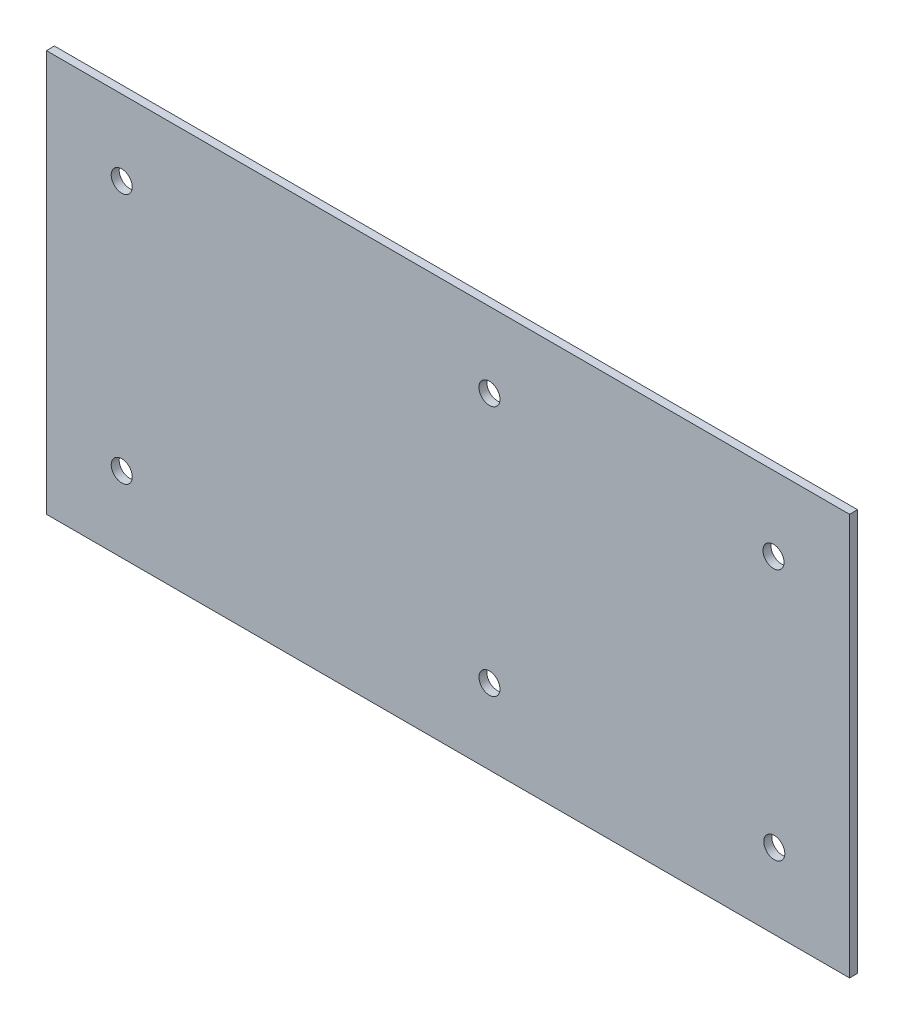
ISO-10303-21;
HEADER;
FILE_DESCRIPTION(('STEP AP214'),'2;1');
FILE_NAME('part.step','',(''),(''),'','','');
FILE_SCHEMA(('AUTOMOTIVE_DESIGN { 1 0 10303 214 1 1 1 1 }'));
ENDSEC;
DATA;
#1=APPLICATION_CONTEXT('core data for automotive mechanical design processes');
#2=APPLICATION_PROTOCOL_DEFINITION('international standard','automotive_design',2000,#1);
#3=PRODUCT_CONTEXT('',#1,'mechanical');
#4=PRODUCT('Part','Part','',(#3));
#5=PRODUCT_RELATED_PRODUCT_CATEGORY('part','',(#4));
#6=PRODUCT_DEFINITION_FORMATION('','',#4);
#7=PRODUCT_DEFINITION_CONTEXT('part definition',#1,'design');
#8=PRODUCT_DEFINITION('design','',#6,#7);
#9=PRODUCT_DEFINITION_SHAPE('','',#8);
#10=(LENGTH_UNIT() NAMED_UNIT(*) SI_UNIT(.MILLI.,.METRE.));
#11=(NAMED_UNIT(*) PLANE_ANGLE_UNIT() SI_UNIT($,.RADIAN.));
#12=(NAMED_UNIT(*) SI_UNIT($,.STERADIAN.) SOLID_ANGLE_UNIT());
#13=UNCERTAINTY_MEASURE_WITH_UNIT(LENGTH_MEASURE(1.E-05),#10,'distance_accuracy_value','');
#14=(GEOMETRIC_REPRESENTATION_CONTEXT(3) GLOBAL_UNCERTAINTY_ASSIGNED_CONTEXT((#13)) GLOBAL_UNIT_ASSIGNED_CONTEXT((#10,
#11,#12)) REPRESENTATION_CONTEXT('',''));
#15=CARTESIAN_POINT('',(0.,0.,0.));
#16=DIRECTION('',(0.,0.,1.));
#17=DIRECTION('',(1.,0.,0.));
#18=AXIS2_PLACEMENT_3D('',#15,#16,#17);
#19=CARTESIAN_POINT('',(0.,0.,1.5875));
#20=DIRECTION('',(0.,0.,1.));
#21=DIRECTION('',(1.,0.,0.));
#22=AXIS2_PLACEMENT_3D('',#19,#20,#21);
#23=PLANE('',#22);
#24=CARTESIAN_POINT('',(40.5172410112099,-26.9254115006689,1.5875));
#25=DIRECTION('',(0.,0.,1.));
#26=DIRECTION('',(1.,0.,0.));
#27=AXIS2_PLACEMENT_3D('',#24,#25,#26);
#28=CIRCLE('',#27,2.0955);
#29=CARTESIAN_POINT('',(42.6127410112099,-26.9254115006689,1.5875));
#30=VERTEX_POINT('',#29);
#31=EDGE_CURVE('E158',#30,#30,#28,.T.);
#32=ORIENTED_EDGE('',*,*,#31,.F.);
#33=EDGE_LOOP('',(#32));
#34=FACE_BOUND('',#33,.T.);
#35=CARTESIAN_POINT('',(40.5172410112098,23.0745884993311,1.5875));
#36=DIRECTION('',(0.,0.,1.));
#37=DIRECTION('',(1.,0.,0.));
#38=AXIS2_PLACEMENT_3D('',#35,#36,#37);
#39=CIRCLE('',#38,2.0955);
#40=CARTESIAN_POINT('',(42.6127410112098,23.0745884993311,1.5875));
#41=VERTEX_POINT('',#40);
#42=EDGE_CURVE('E142',#41,#41,#39,.T.);
#43=ORIENTED_EDGE('',*,*,#42,.F.);
#44=EDGE_LOOP('',(#43));
#45=FACE_BOUND('',#44,.T.);
#46=CARTESIAN_POINT('',(-32.7327589887902,23.0745884993311,1.5875));
#47=DIRECTION('',(0.,0.,1.));
#48=DIRECTION('',(1.,0.,0.));
#49=AXIS2_PLACEMENT_3D('',#46,#47,#48);
#50=CIRCLE('',#49,2.0955);
#51=CARTESIAN_POINT('',(-30.6372589887902,23.0745884993311,1.5875));
#52=VERTEX_POINT('',#51);
#53=EDGE_CURVE('E112',#52,#52,#50,.T.);
#54=ORIENTED_EDGE('',*,*,#53,.F.);
#55=EDGE_LOOP('',(#54));
#56=FACE_BOUND('',#55,.T.);
#57=DIRECTION('',(0.,-1.,0.));
#58=VECTOR('',#57,1.);
#59=CARTESIAN_POINT('',(-47.7339989887902,38.0758284993311,1.5875));
#60=LINE('',#59,#58);
#61=CARTESIAN_POINT('',(-47.7339989887902,38.0758284993311,1.5875));
#62=VERTEX_POINT('',#61);
#63=CARTESIAN_POINT('',(-47.7339989887902,-41.9266515006689,1.5875));
#64=VERTEX_POINT('',#63);
#65=EDGE_CURVE('E92',#62,#64,#60,.T.);
#66=ORIENTED_EDGE('',*,*,#65,.T.);
#67=DIRECTION('',(1.,0.,0.));
#68=VECTOR('',#67,1.);
#69=CARTESIAN_POINT('',(-47.7339989887902,-41.9266515006689,1.5875));
#70=LINE('',#69,#68);
#71=CARTESIAN_POINT('',(112.26848101121,-41.9266515006689,1.5875));
#72=VERTEX_POINT('',#71);
#73=EDGE_CURVE('E87',#64,#72,#70,.T.);
#74=ORIENTED_EDGE('',*,*,#73,.T.);
#75=DIRECTION('',(0.,1.,0.));
#76=VECTOR('',#75,1.);
#77=CARTESIAN_POINT('',(112.26848101121,38.0758284993311,1.5875));
#78=LINE('',#77,#76);
#79=CARTESIAN_POINT('',(112.26848101121,38.0758284993311,1.5875));
#80=VERTEX_POINT('',#79);
#81=EDGE_CURVE('E90',#72,#80,#78,.T.);
#82=ORIENTED_EDGE('',*,*,#81,.T.);
#83=DIRECTION('',(-1.,0.,0.));
#84=VECTOR('',#83,1.);
#85=CARTESIAN_POINT('',(-47.7339989887902,38.0758284993311,1.5875));
#86=LINE('',#85,#84);
#87=EDGE_CURVE('E57',#80,#62,#86,.T.);
#88=ORIENTED_EDGE('',*,*,#87,.T.);
#89=EDGE_LOOP('',(#66,#74,#82,#88));
#90=FACE_BOUND('',#89,.T.);
#91=CARTESIAN_POINT('',(-32.7327589887902,-26.9254115006689,1.5875));
#92=DIRECTION('',(0.,0.,1.));
#93=DIRECTION('',(1.,0.,0.));
#94=AXIS2_PLACEMENT_3D('',#91,#92,#93);
#95=CIRCLE('',#94,2.0955);
#96=CARTESIAN_POINT('',(-30.6372589887902,-26.9254115006689,1.5875));
#97=VERTEX_POINT('',#96);
#98=EDGE_CURVE('E134',#97,#97,#95,.T.);
#99=ORIENTED_EDGE('',*,*,#98,.F.);
#100=EDGE_LOOP('',(#99));
#101=FACE_BOUND('',#100,.T.);
#102=CARTESIAN_POINT('',(97.1085339887547,23.2332955217862,1.5875));
#103=DIRECTION('',(0.,0.,1.));
#104=DIRECTION('',(1.,0.,0.));
#105=AXIS2_PLACEMENT_3D('',#102,#103,#104);
#106=CIRCLE('',#105,2.0955);
#107=CARTESIAN_POINT('',(99.2040339887547,23.2332955217862,1.5875));
#108=VERTEX_POINT('',#107);
#109=EDGE_CURVE('E150',#108,#108,#106,.T.);
#110=ORIENTED_EDGE('',*,*,#109,.F.);
#111=EDGE_LOOP('',(#110));
#112=FACE_BOUND('',#111,.T.);
#113=CARTESIAN_POINT('',(97.2672410112098,-26.9254115006689,1.5875));
#114=DIRECTION('',(0.,0.,1.));
#115=DIRECTION('',(1.,0.,0.));
#116=AXIS2_PLACEMENT_3D('',#113,#114,#115);
#117=CIRCLE('',#116,2.0955);
#118=CARTESIAN_POINT('',(99.3627410112098,-26.9254115006689,1.5875));
#119=VERTEX_POINT('',#118);
#120=EDGE_CURVE('E166',#119,#119,#117,.T.);
#121=ORIENTED_EDGE('',*,*,#120,.F.);
#122=EDGE_LOOP('',(#121));
#123=FACE_BOUND('',#122,.T.);
#124=ADVANCED_FACE('F39',(#34,#45,#56,#90,#101,#112,#123),#23,.T.);
#125=CARTESIAN_POINT('',(0.,0.,0.));
#126=DIRECTION('',(0.,0.,1.));
#127=DIRECTION('',(1.,0.,0.));
#128=AXIS2_PLACEMENT_3D('',#125,#126,#127);
#129=PLANE('',#128);
#130=DIRECTION('',(0.,-1.,0.));
#131=VECTOR('',#130,1.);
#132=CARTESIAN_POINT('',(-47.7339989887902,38.0758284993311,0.));
#133=LINE('',#132,#131);
#134=CARTESIAN_POINT('',(-47.7339989887902,38.0758284993311,0.));
#135=VERTEX_POINT('',#134);
#136=CARTESIAN_POINT('',(-47.7339989887902,-41.9266515006689,0.));
#137=VERTEX_POINT('',#136);
#138=EDGE_CURVE('E108',#135,#137,#133,.T.);
#139=ORIENTED_EDGE('',*,*,#138,.F.);
#140=DIRECTION('',(-1.,0.,0.));
#141=VECTOR('',#140,1.);
#142=CARTESIAN_POINT('',(-47.7339989887902,38.0758284993311,0.));
#143=LINE('',#142,#141);
#144=CARTESIAN_POINT('',(112.26848101121,38.0758284993311,0.));
#145=VERTEX_POINT('',#144);
#146=EDGE_CURVE('E80',#145,#135,#143,.T.);
#147=ORIENTED_EDGE('',*,*,#146,.F.);
#148=DIRECTION('',(0.,1.,0.));
#149=VECTOR('',#148,1.);
#150=CARTESIAN_POINT('',(112.26848101121,38.0758284993311,0.));
#151=LINE('',#150,#149);
#152=CARTESIAN_POINT('',(112.26848101121,-41.9266515006689,0.));
#153=VERTEX_POINT('',#152);
#154=EDGE_CURVE('E74',#153,#145,#151,.T.);
#155=ORIENTED_EDGE('',*,*,#154,.F.);
#156=DIRECTION('',(1.,0.,0.));
#157=VECTOR('',#156,1.);
#158=CARTESIAN_POINT('',(-47.7339989887902,-41.9266515006689,0.));
#159=LINE('',#158,#157);
#160=EDGE_CURVE('E97',#137,#153,#159,.T.);
#161=ORIENTED_EDGE('',*,*,#160,.F.);
#162=EDGE_LOOP('',(#139,#147,#155,#161));
#163=FACE_BOUND('',#162,.T.);
#164=CARTESIAN_POINT('',(-32.7327589887902,23.0745884993311,0.));
#165=DIRECTION('',(0.,0.,1.));
#166=DIRECTION('',(1.,0.,0.));
#167=AXIS2_PLACEMENT_3D('',#164,#165,#166);
#168=CIRCLE('',#167,2.0955);
#169=CARTESIAN_POINT('',(-30.6372589887902,23.0745884993311,0.));
#170=VERTEX_POINT('',#169);
#171=EDGE_CURVE('E130',#170,#170,#168,.T.);
#172=ORIENTED_EDGE('',*,*,#171,.T.);
#173=EDGE_LOOP('',(#172));
#174=FACE_BOUND('',#173,.T.);
#175=CARTESIAN_POINT('',(-32.7327589887902,-26.9254115006689,0.));
#176=DIRECTION('',(0.,0.,1.));
#177=DIRECTION('',(1.,0.,0.));
#178=AXIS2_PLACEMENT_3D('',#175,#176,#177);
#179=CIRCLE('',#178,2.0955);
#180=CARTESIAN_POINT('',(-30.6372589887902,-26.9254115006689,0.));
#181=VERTEX_POINT('',#180);
#182=EDGE_CURVE('E138',#181,#181,#179,.T.);
#183=ORIENTED_EDGE('',*,*,#182,.T.);
#184=EDGE_LOOP('',(#183));
#185=FACE_BOUND('',#184,.T.);
#186=CARTESIAN_POINT('',(40.5172410112098,23.0745884993311,0.));
#187=DIRECTION('',(0.,0.,1.));
#188=DIRECTION('',(1.,0.,0.));
#189=AXIS2_PLACEMENT_3D('',#186,#187,#188);
#190=CIRCLE('',#189,2.0955);
#191=CARTESIAN_POINT('',(42.6127410112098,23.0745884993311,0.));
#192=VERTEX_POINT('',#191);
#193=EDGE_CURVE('E146',#192,#192,#190,.T.);
#194=ORIENTED_EDGE('',*,*,#193,.T.);
#195=EDGE_LOOP('',(#194));
#196=FACE_BOUND('',#195,.T.);
#197=CARTESIAN_POINT('',(97.1085339887547,23.2332955217862,0.));
#198=DIRECTION('',(0.,0.,1.));
#199=DIRECTION('',(1.,0.,0.));
#200=AXIS2_PLACEMENT_3D('',#197,#198,#199);
#201=CIRCLE('',#200,2.0955);
#202=CARTESIAN_POINT('',(99.2040339887547,23.2332955217862,0.));
#203=VERTEX_POINT('',#202);
#204=EDGE_CURVE('E154',#203,#203,#201,.T.);
#205=ORIENTED_EDGE('',*,*,#204,.T.);
#206=EDGE_LOOP('',(#205));
#207=FACE_BOUND('',#206,.T.);
#208=CARTESIAN_POINT('',(40.5172410112099,-26.9254115006689,0.));
#209=DIRECTION('',(0.,0.,1.));
#210=DIRECTION('',(1.,0.,0.));
#211=AXIS2_PLACEMENT_3D('',#208,#209,#210);
#212=CIRCLE('',#211,2.0955);
#213=CARTESIAN_POINT('',(42.6127410112099,-26.9254115006689,0.));
#214=VERTEX_POINT('',#213);
#215=EDGE_CURVE('E162',#214,#214,#212,.T.);
#216=ORIENTED_EDGE('',*,*,#215,.T.);
#217=EDGE_LOOP('',(#216));
#218=FACE_BOUND('',#217,.T.);
#219=CARTESIAN_POINT('',(97.2672410112098,-26.9254115006689,0.));
#220=DIRECTION('',(0.,0.,1.));
#221=DIRECTION('',(1.,0.,0.));
#222=AXIS2_PLACEMENT_3D('',#219,#220,#221);
#223=CIRCLE('',#222,2.0955);
#224=CARTESIAN_POINT('',(99.3627410112098,-26.9254115006689,0.));
#225=VERTEX_POINT('',#224);
#226=EDGE_CURVE('E170',#225,#225,#223,.T.);
#227=ORIENTED_EDGE('',*,*,#226,.T.);
#228=EDGE_LOOP('',(#227));
#229=FACE_BOUND('',#228,.T.);
#230=ADVANCED_FACE('F125',(#163,#174,#185,#196,#207,#218,#229),#129,.F.);
#231=CARTESIAN_POINT('',(-47.7339989887902,38.0758284993311,1.5875));
#232=DIRECTION('',(1.,0.,0.));
#233=DIRECTION('',(0.,0.,-1.));
#234=AXIS2_PLACEMENT_3D('',#231,#232,#233);
#235=PLANE('',#234);
#236=ORIENTED_EDGE('',*,*,#138,.T.);
#237=DIRECTION('',(0.,0.,-1.));
#238=VECTOR('',#237,1.);
#239=CARTESIAN_POINT('',(-47.7339989887902,-41.9266515006689,1.5875));
#240=LINE('',#239,#238);
#241=EDGE_CURVE('E11',#64,#137,#240,.T.);
#242=ORIENTED_EDGE('',*,*,#241,.F.);
#243=ORIENTED_EDGE('',*,*,#65,.F.);
#244=DIRECTION('',(0.,0.,-1.));
#245=VECTOR('',#244,1.);
#246=CARTESIAN_POINT('',(-47.7339989887902,38.0758284993311,1.5875));
#247=LINE('',#246,#245);
#248=EDGE_CURVE('E104',#62,#135,#247,.T.);
#249=ORIENTED_EDGE('',*,*,#248,.T.);
#250=EDGE_LOOP('',(#236,#242,#243,#249));
#251=FACE_BOUND('',#250,.T.);
#252=ADVANCED_FACE('F41',(#251),#235,.F.);
#253=CARTESIAN_POINT('',(-47.7339989887902,-41.9266515006689,1.5875));
#254=DIRECTION('',(0.,1.,0.));
#255=DIRECTION('',(0.,0.,1.));
#256=AXIS2_PLACEMENT_3D('',#253,#254,#255);
#257=PLANE('',#256);
#258=ORIENTED_EDGE('',*,*,#160,.T.);
#259=DIRECTION('',(0.,0.,-1.));
#260=VECTOR('',#259,1.);
#261=CARTESIAN_POINT('',(112.26848101121,-41.9266515006689,1.5875));
#262=LINE('',#261,#260);
#263=EDGE_CURVE('E49',#72,#153,#262,.T.);
#264=ORIENTED_EDGE('',*,*,#263,.F.);
#265=ORIENTED_EDGE('',*,*,#73,.F.);
#266=ORIENTED_EDGE('',*,*,#241,.T.);
#267=EDGE_LOOP('',(#258,#264,#265,#266));
#268=FACE_BOUND('',#267,.T.);
#269=ADVANCED_FACE('F96',(#268),#257,.F.);
#270=CARTESIAN_POINT('',(112.26848101121,38.0758284993311,1.5875));
#271=DIRECTION('',(-1.,0.,0.));
#272=DIRECTION('',(0.,0.,1.));
#273=AXIS2_PLACEMENT_3D('',#270,#271,#272);
#274=PLANE('',#273);
#275=ORIENTED_EDGE('',*,*,#154,.T.);
#276=DIRECTION('',(0.,0.,-1.));
#277=VECTOR('',#276,1.);
#278=CARTESIAN_POINT('',(112.26848101121,38.0758284993311,1.5875));
#279=LINE('',#278,#277);
#280=EDGE_CURVE('E99',#80,#145,#279,.T.);
#281=ORIENTED_EDGE('',*,*,#280,.F.);
#282=ORIENTED_EDGE('',*,*,#81,.F.);
#283=ORIENTED_EDGE('',*,*,#263,.T.);
#284=EDGE_LOOP('',(#275,#281,#282,#283));
#285=FACE_BOUND('',#284,.T.);
#286=ADVANCED_FACE('F100',(#285),#274,.F.);
#287=CARTESIAN_POINT('',(-47.7339989887902,38.0758284993311,1.5875));
#288=DIRECTION('',(0.,-1.,0.));
#289=DIRECTION('',(0.,0.,-1.));
#290=AXIS2_PLACEMENT_3D('',#287,#288,#289);
#291=PLANE('',#290);
#292=ORIENTED_EDGE('',*,*,#146,.T.);
#293=ORIENTED_EDGE('',*,*,#248,.F.);
#294=ORIENTED_EDGE('',*,*,#87,.F.);
#295=ORIENTED_EDGE('',*,*,#280,.T.);
#296=EDGE_LOOP('',(#292,#293,#294,#295));
#297=FACE_BOUND('',#296,.T.);
#298=ADVANCED_FACE('F122',(#297),#291,.F.);
#299=CARTESIAN_POINT('',(-32.7327589887902,23.0745884993311,1.5875));
#300=DIRECTION('',(0.,0.,-1.));
#301=DIRECTION('',(-1.,0.,0.));
#302=AXIS2_PLACEMENT_3D('',#299,#300,#301);
#303=CYLINDRICAL_SURFACE('',#302,2.0955);
#304=ORIENTED_EDGE('',*,*,#53,.T.);
#305=EDGE_LOOP('',(#304));
#306=FACE_BOUND('',#305,.T.);
#307=ORIENTED_EDGE('',*,*,#171,.F.);
#308=EDGE_LOOP('',(#307));
#309=FACE_BOUND('',#308,.T.);
#310=ADVANCED_FACE('F191',(#306,#309),#303,.F.);
#311=CARTESIAN_POINT('',(-32.7327589887902,-26.9254115006689,1.5875));
#312=DIRECTION('',(0.,0.,-1.));
#313=DIRECTION('',(-1.,0.,0.));
#314=AXIS2_PLACEMENT_3D('',#311,#312,#313);
#315=CYLINDRICAL_SURFACE('',#314,2.0955);
#316=ORIENTED_EDGE('',*,*,#98,.T.);
#317=EDGE_LOOP('',(#316));
#318=FACE_BOUND('',#317,.T.);
#319=ORIENTED_EDGE('',*,*,#182,.F.);
#320=EDGE_LOOP('',(#319));
#321=FACE_BOUND('',#320,.T.);
#322=ADVANCED_FACE('F237',(#318,#321),#315,.F.);
#323=CARTESIAN_POINT('',(40.5172410112098,23.0745884993311,1.5875));
#324=DIRECTION('',(0.,0.,-1.));
#325=DIRECTION('',(-1.,0.,0.));
#326=AXIS2_PLACEMENT_3D('',#323,#324,#325);
#327=CYLINDRICAL_SURFACE('',#326,2.0955);
#328=ORIENTED_EDGE('',*,*,#42,.T.);
#329=EDGE_LOOP('',(#328));
#330=FACE_BOUND('',#329,.T.);
#331=ORIENTED_EDGE('',*,*,#193,.F.);
#332=EDGE_LOOP('',(#331));
#333=FACE_BOUND('',#332,.T.);
#334=ADVANCED_FACE('F245',(#330,#333),#327,.F.);
#335=CARTESIAN_POINT('',(97.1085339887547,23.2332955217862,1.5875));
#336=DIRECTION('',(0.,0.,-1.));
#337=DIRECTION('',(-1.,0.,0.));
#338=AXIS2_PLACEMENT_3D('',#335,#336,#337);
#339=CYLINDRICAL_SURFACE('',#338,2.0955);
#340=ORIENTED_EDGE('',*,*,#109,.T.);
#341=EDGE_LOOP('',(#340));
#342=FACE_BOUND('',#341,.T.);
#343=ORIENTED_EDGE('',*,*,#204,.F.);
#344=EDGE_LOOP('',(#343));
#345=FACE_BOUND('',#344,.T.);
#346=ADVANCED_FACE('F253',(#342,#345),#339,.F.);
#347=CARTESIAN_POINT('',(40.5172410112099,-26.9254115006689,1.5875));
#348=DIRECTION('',(0.,0.,-1.));
#349=DIRECTION('',(-1.,0.,0.));
#350=AXIS2_PLACEMENT_3D('',#347,#348,#349);
#351=CYLINDRICAL_SURFACE('',#350,2.0955);
#352=ORIENTED_EDGE('',*,*,#31,.T.);
#353=EDGE_LOOP('',(#352));
#354=FACE_BOUND('',#353,.T.);
#355=ORIENTED_EDGE('',*,*,#215,.F.);
#356=EDGE_LOOP('',(#355));
#357=FACE_BOUND('',#356,.T.);
#358=ADVANCED_FACE('F262',(#354,#357),#351,.F.);
#359=CARTESIAN_POINT('',(97.2672410112098,-26.9254115006689,1.5875));
#360=DIRECTION('',(0.,0.,-1.));
#361=DIRECTION('',(-1.,0.,0.));
#362=AXIS2_PLACEMENT_3D('',#359,#360,#361);
#363=CYLINDRICAL_SURFACE('',#362,2.0955);
#364=ORIENTED_EDGE('',*,*,#120,.T.);
#365=EDGE_LOOP('',(#364));
#366=FACE_BOUND('',#365,.T.);
#367=ORIENTED_EDGE('',*,*,#226,.F.);
#368=EDGE_LOOP('',(#367));
#369=FACE_BOUND('',#368,.T.);
#370=ADVANCED_FACE('F178',(#366,#369),#363,.F.);
#371=CLOSED_SHELL('',(#124,#230,#252,#269,#286,#298,#310,#322,#334,#346,#358,#370));
#372=MANIFOLD_SOLID_BREP('B2',#371);
#373=ADVANCED_BREP_SHAPE_REPRESENTATION('',(#18,#372),#14);
#374=SHAPE_DEFINITION_REPRESENTATION(#9,#373);
ENDSEC;
END-ISO-10303-21;
